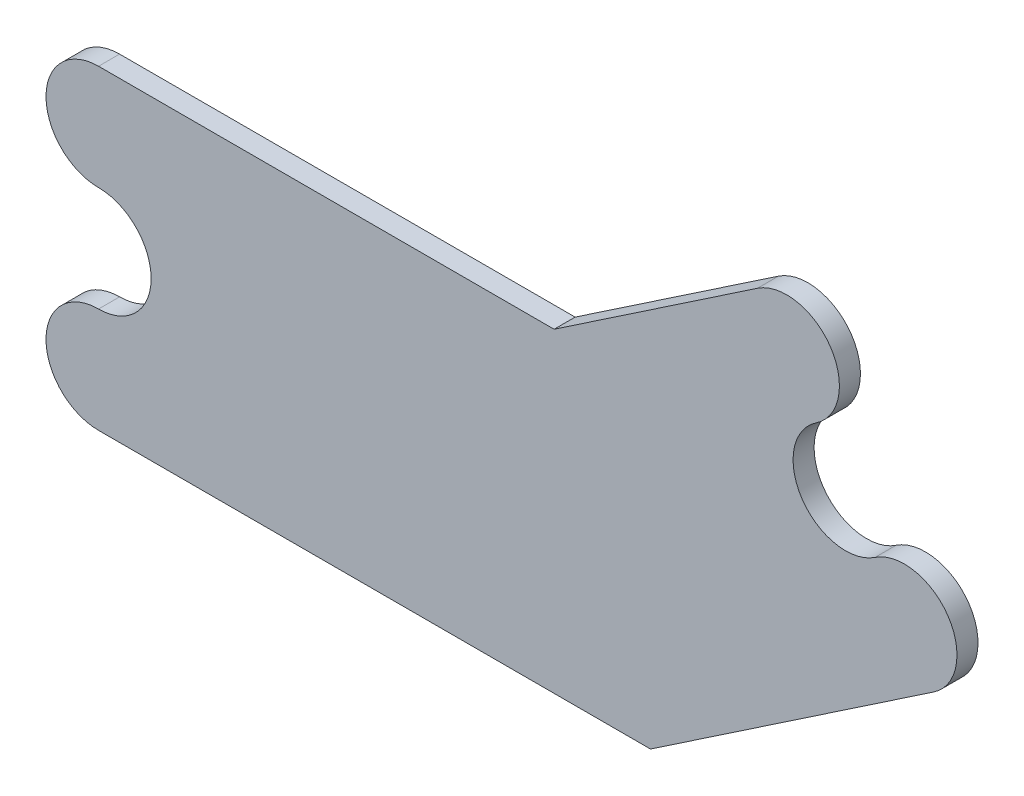
ISO-10303-21;
HEADER;
FILE_DESCRIPTION(('STEP AP214'),'2;1');
FILE_NAME('part.step','',(''),(''),'','','');
FILE_SCHEMA(('AUTOMOTIVE_DESIGN { 1 0 10303 214 1 1 1 1 }'));
ENDSEC;
DATA;
#1=APPLICATION_CONTEXT('core data for automotive mechanical design processes');
#2=APPLICATION_PROTOCOL_DEFINITION('international standard','automotive_design',2000,#1);
#3=PRODUCT_CONTEXT('',#1,'mechanical');
#4=PRODUCT('Part','Part','',(#3));
#5=PRODUCT_RELATED_PRODUCT_CATEGORY('part','',(#4));
#6=PRODUCT_DEFINITION_FORMATION('','',#4);
#7=PRODUCT_DEFINITION_CONTEXT('part definition',#1,'design');
#8=PRODUCT_DEFINITION('design','',#6,#7);
#9=PRODUCT_DEFINITION_SHAPE('','',#8);
#10=(LENGTH_UNIT() NAMED_UNIT(*) SI_UNIT(.MILLI.,.METRE.));
#11=(NAMED_UNIT(*) PLANE_ANGLE_UNIT() SI_UNIT($,.RADIAN.));
#12=(NAMED_UNIT(*) SI_UNIT($,.STERADIAN.) SOLID_ANGLE_UNIT());
#13=UNCERTAINTY_MEASURE_WITH_UNIT(LENGTH_MEASURE(1.E-05),#10,'distance_accuracy_value','');
#14=(GEOMETRIC_REPRESENTATION_CONTEXT(3) GLOBAL_UNCERTAINTY_ASSIGNED_CONTEXT((#13)) GLOBAL_UNIT_ASSIGNED_CONTEXT((#10,
#11,#12)) REPRESENTATION_CONTEXT('',''));
#15=CARTESIAN_POINT('',(0.,0.,0.));
#16=DIRECTION('',(0.,0.,1.));
#17=DIRECTION('',(1.,0.,0.));
#18=AXIS2_PLACEMENT_3D('',#15,#16,#17);
#19=CARTESIAN_POINT('',(0.,0.,-1.2));
#20=DIRECTION('',(0.,-1.,0.));
#21=DIRECTION('',(1.,0.,0.));
#22=AXIS2_PLACEMENT_3D('',#19,#20,#21);
#23=PLANE('',#22);
#24=DIRECTION('',(1.,0.,0.));
#25=VECTOR('',#24,1.);
#26=CARTESIAN_POINT('',(0.,0.,0.));
#27=LINE('',#26,#25);
#28=CARTESIAN_POINT('',(-26.,0.,0.));
#29=VERTEX_POINT('',#28);
#30=CARTESIAN_POINT('',(5.50315226625583,0.,0.));
#31=VERTEX_POINT('',#30);
#32=EDGE_CURVE('E170',#29,#31,#27,.T.);
#33=ORIENTED_EDGE('',*,*,#32,.F.);
#34=DIRECTION('',(0.,0.,1.));
#35=VECTOR('',#34,1.);
#36=CARTESIAN_POINT('',(-26.,0.,-1.2));
#37=LINE('',#36,#35);
#38=CARTESIAN_POINT('',(-26.,0.,-1.2));
#39=VERTEX_POINT('',#38);
#40=EDGE_CURVE('E11',#39,#29,#37,.T.);
#41=ORIENTED_EDGE('',*,*,#40,.F.);
#42=DIRECTION('',(1.,0.,0.));
#43=VECTOR('',#42,1.);
#44=CARTESIAN_POINT('',(0.,0.,-1.2));
#45=LINE('',#44,#43);
#46=CARTESIAN_POINT('',(5.50315226625583,0.,-1.2));
#47=VERTEX_POINT('',#46);
#48=EDGE_CURVE('E55',#39,#47,#45,.T.);
#49=ORIENTED_EDGE('',*,*,#48,.T.);
#50=DIRECTION('',(0.,0.,1.));
#51=VECTOR('',#50,1.);
#52=CARTESIAN_POINT('',(5.50315226625583,0.,-1.2));
#53=LINE('',#52,#51);
#54=EDGE_CURVE('E40',#47,#31,#53,.T.);
#55=ORIENTED_EDGE('',*,*,#54,.T.);
#56=EDGE_LOOP('',(#33,#41,#49,#55));
#57=FACE_BOUND('',#56,.T.);
#58=ADVANCED_FACE('F36',(#57),#23,.T.);
#59=CARTESIAN_POINT('',(-26.,3.,-1.2));
#60=DIRECTION('',(0.,0.,1.));
#61=DIRECTION('',(1.,0.,0.));
#62=AXIS2_PLACEMENT_3D('',#59,#60,#61);
#63=CYLINDRICAL_SURFACE('',#62,3.);
#64=CARTESIAN_POINT('',(-26.,3.,0.));
#65=DIRECTION('',(0.,0.,1.));
#66=DIRECTION('',(1.,0.,0.));
#67=AXIS2_PLACEMENT_3D('',#64,#65,#66);
#68=CIRCLE('',#67,3.);
#69=CARTESIAN_POINT('',(-26.,6.,0.));
#70=VERTEX_POINT('',#69);
#71=EDGE_CURVE('E168',#70,#29,#68,.T.);
#72=ORIENTED_EDGE('',*,*,#71,.F.);
#73=DIRECTION('',(0.,0.,1.));
#74=VECTOR('',#73,1.);
#75=CARTESIAN_POINT('',(-26.,6.,-1.2));
#76=LINE('',#75,#74);
#77=CARTESIAN_POINT('',(-26.,6.,-1.2));
#78=VERTEX_POINT('',#77);
#79=EDGE_CURVE('E46',#78,#70,#76,.T.);
#80=ORIENTED_EDGE('',*,*,#79,.F.);
#81=CARTESIAN_POINT('',(-26.,3.,-1.2));
#82=DIRECTION('',(0.,0.,1.));
#83=DIRECTION('',(1.,0.,0.));
#84=AXIS2_PLACEMENT_3D('',#81,#82,#83);
#85=CIRCLE('',#84,3.);
#86=EDGE_CURVE('E137',#78,#39,#85,.T.);
#87=ORIENTED_EDGE('',*,*,#86,.T.);
#88=ORIENTED_EDGE('',*,*,#40,.T.);
#89=EDGE_LOOP('',(#72,#80,#87,#88));
#90=FACE_BOUND('',#89,.T.);
#91=ADVANCED_FACE('F187',(#90),#63,.T.);
#92=CARTESIAN_POINT('',(-26.,9.,-1.2));
#93=DIRECTION('',(0.,0.,1.));
#94=DIRECTION('',(1.,0.,0.));
#95=AXIS2_PLACEMENT_3D('',#92,#93,#94);
#96=CYLINDRICAL_SURFACE('',#95,3.);
#97=CARTESIAN_POINT('',(-26.,9.,0.));
#98=DIRECTION('',(0.,0.,-1.));
#99=DIRECTION('',(1.,0.,0.));
#100=AXIS2_PLACEMENT_3D('',#97,#98,#99);
#101=CIRCLE('',#100,3.);
#102=CARTESIAN_POINT('',(-26.,12.,0.));
#103=VERTEX_POINT('',#102);
#104=EDGE_CURVE('E125',#103,#70,#101,.T.);
#105=ORIENTED_EDGE('',*,*,#104,.F.);
#106=DIRECTION('',(0.,0.,1.));
#107=VECTOR('',#106,1.);
#108=CARTESIAN_POINT('',(-26.,12.,-1.2));
#109=LINE('',#108,#107);
#110=CARTESIAN_POINT('',(-26.,12.,-1.2));
#111=VERTEX_POINT('',#110);
#112=EDGE_CURVE('E120',#111,#103,#109,.T.);
#113=ORIENTED_EDGE('',*,*,#112,.F.);
#114=CARTESIAN_POINT('',(-26.,9.,-1.2));
#115=DIRECTION('',(0.,0.,-1.));
#116=DIRECTION('',(1.,0.,0.));
#117=AXIS2_PLACEMENT_3D('',#114,#115,#116);
#118=CIRCLE('',#117,3.);
#119=EDGE_CURVE('E123',#111,#78,#118,.T.);
#120=ORIENTED_EDGE('',*,*,#119,.T.);
#121=ORIENTED_EDGE('',*,*,#79,.T.);
#122=EDGE_LOOP('',(#105,#113,#120,#121));
#123=FACE_BOUND('',#122,.T.);
#124=ADVANCED_FACE('F122',(#123),#96,.F.);
#125=CARTESIAN_POINT('',(-26.,15.,-1.2));
#126=DIRECTION('',(0.,0.,1.));
#127=DIRECTION('',(1.,0.,0.));
#128=AXIS2_PLACEMENT_3D('',#125,#126,#127);
#129=CYLINDRICAL_SURFACE('',#128,3.);
#130=CARTESIAN_POINT('',(-26.,15.,0.));
#131=DIRECTION('',(0.,0.,1.));
#132=DIRECTION('',(1.,0.,0.));
#133=AXIS2_PLACEMENT_3D('',#130,#131,#132);
#134=CIRCLE('',#133,3.);
#135=CARTESIAN_POINT('',(-26.,18.,0.));
#136=VERTEX_POINT('',#135);
#137=EDGE_CURVE('E165',#136,#103,#134,.T.);
#138=ORIENTED_EDGE('',*,*,#137,.F.);
#139=DIRECTION('',(0.,0.,1.));
#140=VECTOR('',#139,1.);
#141=CARTESIAN_POINT('',(-26.,18.,-1.2));
#142=LINE('',#141,#140);
#143=CARTESIAN_POINT('',(-26.,18.,-1.2));
#144=VERTEX_POINT('',#143);
#145=EDGE_CURVE('E130',#144,#136,#142,.T.);
#146=ORIENTED_EDGE('',*,*,#145,.F.);
#147=CARTESIAN_POINT('',(-26.,15.,-1.2));
#148=DIRECTION('',(0.,0.,1.));
#149=DIRECTION('',(1.,0.,0.));
#150=AXIS2_PLACEMENT_3D('',#147,#148,#149);
#151=CIRCLE('',#150,3.);
#152=EDGE_CURVE('E135',#144,#111,#151,.T.);
#153=ORIENTED_EDGE('',*,*,#152,.T.);
#154=ORIENTED_EDGE('',*,*,#112,.T.);
#155=EDGE_LOOP('',(#138,#146,#153,#154));
#156=FACE_BOUND('',#155,.T.);
#157=ADVANCED_FACE('F139',(#156),#129,.T.);
#158=CARTESIAN_POINT('',(0.,18.,-1.2));
#159=DIRECTION('',(0.,1.,0.));
#160=DIRECTION('',(-1.,0.,0.));
#161=AXIS2_PLACEMENT_3D('',#158,#159,#160);
#162=PLANE('',#161);
#163=DIRECTION('',(-1.,0.,0.));
#164=VECTOR('',#163,1.);
#165=CARTESIAN_POINT('',(0.,18.,0.));
#166=LINE('',#165,#164);
#167=CARTESIAN_POINT('',(0.,18.,0.));
#168=VERTEX_POINT('',#167);
#169=EDGE_CURVE('E162',#168,#136,#166,.T.);
#170=ORIENTED_EDGE('',*,*,#169,.F.);
#171=DIRECTION('',(0.,0.,1.));
#172=VECTOR('',#171,1.);
#173=CARTESIAN_POINT('',(0.,18.,-1.2));
#174=LINE('',#173,#172);
#175=CARTESIAN_POINT('',(0.,18.,-1.2));
#176=VERTEX_POINT('',#175);
#177=EDGE_CURVE('E174',#176,#168,#174,.T.);
#178=ORIENTED_EDGE('',*,*,#177,.F.);
#179=DIRECTION('',(-1.,0.,0.));
#180=VECTOR('',#179,1.);
#181=CARTESIAN_POINT('',(0.,18.,-1.2));
#182=LINE('',#181,#180);
#183=EDGE_CURVE('E140',#176,#144,#182,.T.);
#184=ORIENTED_EDGE('',*,*,#183,.T.);
#185=ORIENTED_EDGE('',*,*,#145,.T.);
#186=EDGE_LOOP('',(#170,#178,#184,#185));
#187=FACE_BOUND('',#186,.T.);
#188=ADVANCED_FACE('F200',(#187),#162,.T.);
#189=CARTESIAN_POINT('',(0.,18.,-1.2));
#190=DIRECTION('',(-0.559192903470742,0.829037572555045,0.));
#191=DIRECTION('',(-0.829037572555045,-0.559192903470742,0.));
#192=AXIS2_PLACEMENT_3D('',#189,#190,#191);
#193=PLANE('',#192);
#194=DIRECTION('',(-0.829037572555045,-0.559192903470742,0.));
#195=VECTOR('',#194,1.);
#196=CARTESIAN_POINT('',(0.,18.,0.));
#197=LINE('',#196,#195);
#198=CARTESIAN_POINT('',(11.6065260157706,25.8287006485904,0.));
#199=VERTEX_POINT('',#198);
#200=EDGE_CURVE('E159',#199,#168,#197,.T.);
#201=ORIENTED_EDGE('',*,*,#200,.F.);
#202=DIRECTION('',(0.,0.,1.));
#203=VECTOR('',#202,1.);
#204=CARTESIAN_POINT('',(11.6065260157706,25.8287006485904,-1.2));
#205=LINE('',#204,#203);
#206=CARTESIAN_POINT('',(11.6065260157706,25.8287006485904,-1.2));
#207=VERTEX_POINT('',#206);
#208=EDGE_CURVE('E176',#207,#199,#205,.T.);
#209=ORIENTED_EDGE('',*,*,#208,.F.);
#210=DIRECTION('',(-0.829037572555045,-0.559192903470742,0.));
#211=VECTOR('',#210,1.);
#212=CARTESIAN_POINT('',(0.,18.,-1.2));
#213=LINE('',#212,#211);
#214=EDGE_CURVE('E142',#207,#176,#213,.T.);
#215=ORIENTED_EDGE('',*,*,#214,.T.);
#216=ORIENTED_EDGE('',*,*,#177,.T.);
#217=EDGE_LOOP('',(#201,#209,#215,#216));
#218=FACE_BOUND('',#217,.T.);
#219=ADVANCED_FACE('F203',(#218),#193,.T.);
#220=CARTESIAN_POINT('',(13.2841047261828,23.3415879309253,-1.2));
#221=DIRECTION('',(0.,0.,1.));
#222=DIRECTION('',(1.,0.,0.));
#223=AXIS2_PLACEMENT_3D('',#220,#221,#222);
#224=CYLINDRICAL_SURFACE('',#223,3.);
#225=CARTESIAN_POINT('',(13.2841047261828,23.3415879309253,0.));
#226=DIRECTION('',(0.,0.,1.));
#227=DIRECTION('',(1.,0.,0.));
#228=AXIS2_PLACEMENT_3D('',#225,#226,#227);
#229=CIRCLE('',#228,3.);
#230=CARTESIAN_POINT('',(14.9616834365951,20.8544752132601,0.));
#231=VERTEX_POINT('',#230);
#232=EDGE_CURVE('E156',#231,#199,#229,.T.);
#233=ORIENTED_EDGE('',*,*,#232,.F.);
#234=DIRECTION('',(0.,0.,1.));
#235=VECTOR('',#234,1.);
#236=CARTESIAN_POINT('',(14.9616834365951,20.8544752132601,-1.2));
#237=LINE('',#236,#235);
#238=CARTESIAN_POINT('',(14.9616834365951,20.8544752132601,-1.2));
#239=VERTEX_POINT('',#238);
#240=EDGE_CURVE('E178',#239,#231,#237,.T.);
#241=ORIENTED_EDGE('',*,*,#240,.F.);
#242=CARTESIAN_POINT('',(13.2841047261828,23.3415879309253,-1.2));
#243=DIRECTION('',(0.,0.,1.));
#244=DIRECTION('',(1.,0.,0.));
#245=AXIS2_PLACEMENT_3D('',#242,#243,#244);
#246=CIRCLE('',#245,3.);
#247=EDGE_CURVE('E231',#239,#207,#246,.T.);
#248=ORIENTED_EDGE('',*,*,#247,.T.);
#249=ORIENTED_EDGE('',*,*,#208,.T.);
#250=EDGE_LOOP('',(#233,#241,#248,#249));
#251=FACE_BOUND('',#250,.T.);
#252=ADVANCED_FACE('F207',(#251),#224,.T.);
#253=CARTESIAN_POINT('',(16.6392621470073,18.367362495595,-1.2));
#254=DIRECTION('',(0.,0.,1.));
#255=DIRECTION('',(1.,0.,0.));
#256=AXIS2_PLACEMENT_3D('',#253,#254,#255);
#257=CYLINDRICAL_SURFACE('',#256,3.);
#258=CARTESIAN_POINT('',(16.6392621470073,18.367362495595,0.));
#259=DIRECTION('',(0.,0.,-1.));
#260=DIRECTION('',(1.,0.,0.));
#261=AXIS2_PLACEMENT_3D('',#258,#259,#260);
#262=CIRCLE('',#261,3.);
#263=CARTESIAN_POINT('',(18.3168408574195,15.8802497779298,0.));
#264=VERTEX_POINT('',#263);
#265=EDGE_CURVE('E153',#264,#231,#262,.T.);
#266=ORIENTED_EDGE('',*,*,#265,.F.);
#267=DIRECTION('',(0.,0.,1.));
#268=VECTOR('',#267,1.);
#269=CARTESIAN_POINT('',(18.3168408574195,15.8802497779298,-1.2));
#270=LINE('',#269,#268);
#271=CARTESIAN_POINT('',(18.3168408574195,15.8802497779298,-1.2));
#272=VERTEX_POINT('',#271);
#273=EDGE_CURVE('E180',#272,#264,#270,.T.);
#274=ORIENTED_EDGE('',*,*,#273,.F.);
#275=CARTESIAN_POINT('',(16.6392621470073,18.367362495595,-1.2));
#276=DIRECTION('',(0.,0.,-1.));
#277=DIRECTION('',(1.,0.,0.));
#278=AXIS2_PLACEMENT_3D('',#275,#276,#277);
#279=CIRCLE('',#278,3.);
#280=EDGE_CURVE('E235',#272,#239,#279,.T.);
#281=ORIENTED_EDGE('',*,*,#280,.T.);
#282=ORIENTED_EDGE('',*,*,#240,.T.);
#283=EDGE_LOOP('',(#266,#274,#281,#282));
#284=FACE_BOUND('',#283,.T.);
#285=ADVANCED_FACE('F211',(#284),#257,.F.);
#286=CARTESIAN_POINT('',(19.9944195678317,13.3931370602647,-1.2));
#287=DIRECTION('',(0.,0.,1.));
#288=DIRECTION('',(1.,0.,0.));
#289=AXIS2_PLACEMENT_3D('',#286,#287,#288);
#290=CYLINDRICAL_SURFACE('',#289,3.);
#291=CARTESIAN_POINT('',(19.9944195678317,13.3931370602647,0.));
#292=DIRECTION('',(0.,0.,1.));
#293=DIRECTION('',(1.,0.,0.));
#294=AXIS2_PLACEMENT_3D('',#291,#292,#293);
#295=CIRCLE('',#294,3.);
#296=CARTESIAN_POINT('',(21.671998278244,10.9060243425996,0.));
#297=VERTEX_POINT('',#296);
#298=EDGE_CURVE('E150',#297,#264,#295,.T.);
#299=ORIENTED_EDGE('',*,*,#298,.F.);
#300=DIRECTION('',(0.,0.,1.));
#301=VECTOR('',#300,1.);
#302=CARTESIAN_POINT('',(21.671998278244,10.9060243425996,-1.2));
#303=LINE('',#302,#301);
#304=CARTESIAN_POINT('',(21.671998278244,10.9060243425996,-1.2));
#305=VERTEX_POINT('',#304);
#306=EDGE_CURVE('E181',#305,#297,#303,.T.);
#307=ORIENTED_EDGE('',*,*,#306,.F.);
#308=CARTESIAN_POINT('',(19.9944195678317,13.3931370602647,-1.2));
#309=DIRECTION('',(0.,0.,1.));
#310=DIRECTION('',(1.,0.,0.));
#311=AXIS2_PLACEMENT_3D('',#308,#309,#310);
#312=CIRCLE('',#311,3.);
#313=EDGE_CURVE('E224',#305,#272,#312,.T.);
#314=ORIENTED_EDGE('',*,*,#313,.T.);
#315=ORIENTED_EDGE('',*,*,#273,.T.);
#316=EDGE_LOOP('',(#299,#307,#314,#315));
#317=FACE_BOUND('',#316,.T.);
#318=ADVANCED_FACE('F214',(#317),#290,.T.);
#319=CARTESIAN_POINT('',(5.50315226625583,0.,-1.2));
#320=DIRECTION('',(0.559192903470742,-0.829037572555045,0.));
#321=DIRECTION('',(0.829037572555045,0.559192903470742,0.));
#322=AXIS2_PLACEMENT_3D('',#319,#320,#321);
#323=PLANE('',#322);
#324=DIRECTION('',(0.829037572555045,0.559192903470742,0.));
#325=VECTOR('',#324,1.);
#326=CARTESIAN_POINT('',(5.50315226625583,0.,0.));
#327=LINE('',#326,#325);
#328=EDGE_CURVE('E147',#31,#297,#327,.T.);
#329=ORIENTED_EDGE('',*,*,#328,.F.);
#330=ORIENTED_EDGE('',*,*,#54,.F.);
#331=DIRECTION('',(0.829037572555045,0.559192903470742,0.));
#332=VECTOR('',#331,1.);
#333=CARTESIAN_POINT('',(5.50315226625583,0.,-1.2));
#334=LINE('',#333,#332);
#335=EDGE_CURVE('E240',#47,#305,#334,.T.);
#336=ORIENTED_EDGE('',*,*,#335,.T.);
#337=ORIENTED_EDGE('',*,*,#306,.T.);
#338=EDGE_LOOP('',(#329,#330,#336,#337));
#339=FACE_BOUND('',#338,.T.);
#340=ADVANCED_FACE('F38',(#339),#323,.T.);
#341=CARTESIAN_POINT('',(19.9944195678317,13.3931370602647,-1.2));
#342=DIRECTION('',(0.,0.,1.));
#343=DIRECTION('',(1.,0.,0.));
#344=AXIS2_PLACEMENT_3D('',#341,#342,#343);
#345=PLANE('',#344);
#346=ORIENTED_EDGE('',*,*,#48,.F.);
#347=ORIENTED_EDGE('',*,*,#86,.F.);
#348=ORIENTED_EDGE('',*,*,#119,.F.);
#349=ORIENTED_EDGE('',*,*,#152,.F.);
#350=ORIENTED_EDGE('',*,*,#183,.F.);
#351=ORIENTED_EDGE('',*,*,#214,.F.);
#352=ORIENTED_EDGE('',*,*,#247,.F.);
#353=ORIENTED_EDGE('',*,*,#280,.F.);
#354=ORIENTED_EDGE('',*,*,#313,.F.);
#355=ORIENTED_EDGE('',*,*,#335,.F.);
#356=EDGE_LOOP('',(#346,#347,#348,#349,#350,#351,#352,#353,#354,#355));
#357=FACE_BOUND('',#356,.T.);
#358=ADVANCED_FACE('F133',(#357),#345,.F.);
#359=CARTESIAN_POINT('',(19.9944195678317,13.3931370602647,0.));
#360=DIRECTION('',(0.,0.,1.));
#361=DIRECTION('',(1.,0.,0.));
#362=AXIS2_PLACEMENT_3D('',#359,#360,#361);
#363=PLANE('',#362);
#364=ORIENTED_EDGE('',*,*,#32,.T.);
#365=ORIENTED_EDGE('',*,*,#328,.T.);
#366=ORIENTED_EDGE('',*,*,#298,.T.);
#367=ORIENTED_EDGE('',*,*,#265,.T.);
#368=ORIENTED_EDGE('',*,*,#232,.T.);
#369=ORIENTED_EDGE('',*,*,#200,.T.);
#370=ORIENTED_EDGE('',*,*,#169,.T.);
#371=ORIENTED_EDGE('',*,*,#137,.T.);
#372=ORIENTED_EDGE('',*,*,#104,.T.);
#373=ORIENTED_EDGE('',*,*,#71,.T.);
#374=EDGE_LOOP('',(#364,#365,#366,#367,#368,#369,#370,#371,#372,#373));
#375=FACE_BOUND('',#374,.T.);
#376=ADVANCED_FACE('F186',(#375),#363,.T.);
#377=CLOSED_SHELL('',(#58,#91,#124,#157,#188,#219,#252,#285,#318,#340,#358,#376));
#378=MANIFOLD_SOLID_BREP('B2',#377);
#379=ADVANCED_BREP_SHAPE_REPRESENTATION('',(#18,#378),#14);
#380=SHAPE_DEFINITION_REPRESENTATION(#9,#379);
ENDSEC;
END-ISO-10303-21;
